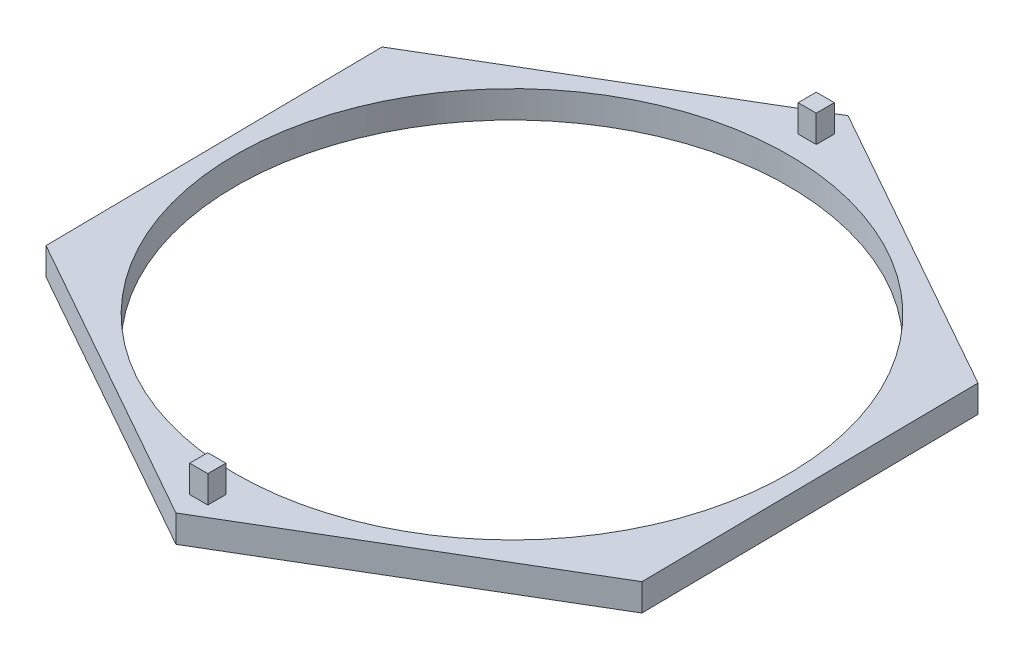
ISO-10303-21;
HEADER;
FILE_DESCRIPTION(('STEP AP214'),'2;1');
FILE_NAME('part.step','',(''),(''),'','','');
FILE_SCHEMA(('AUTOMOTIVE_DESIGN { 1 0 10303 214 1 1 1 1 }'));
ENDSEC;
DATA;
#1=APPLICATION_CONTEXT('core data for automotive mechanical design processes');
#2=APPLICATION_PROTOCOL_DEFINITION('international standard','automotive_design',2000,#1);
#3=PRODUCT_CONTEXT('',#1,'mechanical');
#4=PRODUCT('Part','Part','',(#3));
#5=PRODUCT_RELATED_PRODUCT_CATEGORY('part','',(#4));
#6=PRODUCT_DEFINITION_FORMATION('','',#4);
#7=PRODUCT_DEFINITION_CONTEXT('part definition',#1,'design');
#8=PRODUCT_DEFINITION('design','',#6,#7);
#9=PRODUCT_DEFINITION_SHAPE('','',#8);
#10=(LENGTH_UNIT() NAMED_UNIT(*) SI_UNIT(.MILLI.,.METRE.));
#11=(NAMED_UNIT(*) PLANE_ANGLE_UNIT() SI_UNIT($,.RADIAN.));
#12=(NAMED_UNIT(*) SI_UNIT($,.STERADIAN.) SOLID_ANGLE_UNIT());
#13=UNCERTAINTY_MEASURE_WITH_UNIT(LENGTH_MEASURE(1.E-05),#10,'distance_accuracy_value','');
#14=(GEOMETRIC_REPRESENTATION_CONTEXT(3) GLOBAL_UNCERTAINTY_ASSIGNED_CONTEXT((#13)) GLOBAL_UNIT_ASSIGNED_CONTEXT((#10,
#11,#12)) REPRESENTATION_CONTEXT('',''));
#15=CARTESIAN_POINT('',(0.,0.,0.));
#16=DIRECTION('',(0.,0.,1.));
#17=DIRECTION('',(1.,0.,0.));
#18=AXIS2_PLACEMENT_3D('',#15,#16,#17);
#19=CARTESIAN_POINT('',(0.,3.,0.));
#20=DIRECTION('',(0.,1.,0.));
#21=DIRECTION('',(0.,0.,1.));
#22=AXIS2_PLACEMENT_3D('',#19,#20,#21);
#23=PLANE('',#22);
#24=CARTESIAN_POINT('',(0.,3.,0.));
#25=DIRECTION('',(0.,1.,0.));
#26=DIRECTION('',(0.,0.,1.));
#27=AXIS2_PLACEMENT_3D('',#24,#25,#26);
#28=CIRCLE('',#27,30.5);
#29=CARTESIAN_POINT('',(0.,3.,30.5));
#30=VERTEX_POINT('',#29);
#31=EDGE_CURVE('E214',#30,#30,#28,.T.);
#32=ORIENTED_EDGE('',*,*,#31,.F.);
#33=EDGE_LOOP('',(#32));
#34=FACE_BOUND('',#33,.T.);
#35=DIRECTION('',(-0.860085950933249,0.,0.510149151726482));
#36=VECTOR('',#35,1.);
#37=CARTESIAN_POINT('',(-0.441294633941033,3.,-37.5251727828053));
#38=LINE('',#37,#36);
#39=CARTESIAN_POINT('',(-0.441294633941033,3.,-37.5251727828053));
#40=VERTEX_POINT('',#39);
#41=CARTESIAN_POINT('',(-32.7184002282803,3.,-18.3804140278559));
#42=VERTEX_POINT('',#41);
#43=EDGE_CURVE('E223',#40,#42,#38,.T.);
#44=ORIENTED_EDGE('',*,*,#43,.T.);
#45=DIRECTION('',(0.0117591496475904,0.,0.999930858809531));
#46=VECTOR('',#45,1.);
#47=CARTESIAN_POINT('',(-32.7184002282803,3.,-18.3804140278559));
#48=LINE('',#47,#46);
#49=CARTESIAN_POINT('',(-32.2771055943392,3.,19.1447587549493));
#50=VERTEX_POINT('',#49);
#51=EDGE_CURVE('E227',#42,#50,#48,.T.);
#52=ORIENTED_EDGE('',*,*,#51,.T.);
#53=DIRECTION('',(0.87184510058084,0.,0.489781707083049));
#54=VECTOR('',#53,1.);
#55=CARTESIAN_POINT('',(-32.2771055943392,3.,19.1447587549493));
#56=LINE('',#55,#54);
#57=CARTESIAN_POINT('',(0.441294633941026,3.,37.5251727828053));
#58=VERTEX_POINT('',#57);
#59=EDGE_CURVE('E231',#50,#58,#56,.T.);
#60=ORIENTED_EDGE('',*,*,#59,.T.);
#61=DIRECTION('',(0.860085950933249,0.,-0.510149151726482));
#62=VECTOR('',#61,1.);
#63=CARTESIAN_POINT('',(0.441294633941026,3.,37.5251727828053));
#64=LINE('',#63,#62);
#65=CARTESIAN_POINT('',(32.7184002282803,3.,18.3804140278559));
#66=VERTEX_POINT('',#65);
#67=EDGE_CURVE('E234',#58,#66,#64,.T.);
#68=ORIENTED_EDGE('',*,*,#67,.T.);
#69=DIRECTION('',(-0.0117591496475908,0.,-0.999930858809531));
#70=VECTOR('',#69,1.);
#71=CARTESIAN_POINT('',(32.7184002282803,3.,18.3804140278559));
#72=LINE('',#71,#70);
#73=CARTESIAN_POINT('',(32.2771055943392,3.,-19.1447587549493));
#74=VERTEX_POINT('',#73);
#75=EDGE_CURVE('E237',#66,#74,#72,.T.);
#76=ORIENTED_EDGE('',*,*,#75,.T.);
#77=DIRECTION('',(-0.871845100580839,0.,-0.489781707083049));
#78=VECTOR('',#77,1.);
#79=CARTESIAN_POINT('',(32.2771055943392,3.,-19.1447587549493));
#80=LINE('',#79,#78);
#81=EDGE_CURVE('E240',#74,#40,#80,.T.);
#82=ORIENTED_EDGE('',*,*,#81,.T.);
#83=EDGE_LOOP('',(#44,#52,#60,#68,#76,#82));
#84=FACE_BOUND('',#83,.T.);
#85=DIRECTION('',(1.,0.,0.));
#86=VECTOR('',#85,1.);
#87=CARTESIAN_POINT('',(0.558705366058969,3.,-33.0109900705263));
#88=LINE('',#87,#86);
#89=CARTESIAN_POINT('',(-1.44129463394103,3.,-33.0109900705263));
#90=VERTEX_POINT('',#89);
#91=CARTESIAN_POINT('',(0.558705366058969,3.,-33.0109900705263));
#92=VERTEX_POINT('',#91);
#93=EDGE_CURVE('E175',#90,#92,#88,.T.);
#94=ORIENTED_EDGE('',*,*,#93,.F.);
#95=DIRECTION('',(0.,0.,1.));
#96=VECTOR('',#95,1.);
#97=CARTESIAN_POINT('',(-1.44129463394103,3.,-35.0109900705263));
#98=LINE('',#97,#96);
#99=CARTESIAN_POINT('',(-1.44129463394103,3.,-35.0109900705263));
#100=VERTEX_POINT('',#99);
#101=EDGE_CURVE('E170',#100,#90,#98,.T.);
#102=ORIENTED_EDGE('',*,*,#101,.F.);
#103=DIRECTION('',(-1.,0.,0.));
#104=VECTOR('',#103,1.);
#105=CARTESIAN_POINT('',(0.558705366058968,3.,-35.0109900705263));
#106=LINE('',#105,#104);
#107=CARTESIAN_POINT('',(0.558705366058968,3.,-35.0109900705263));
#108=VERTEX_POINT('',#107);
#109=EDGE_CURVE('E185',#108,#100,#106,.T.);
#110=ORIENTED_EDGE('',*,*,#109,.F.);
#111=DIRECTION('',(0.,0.,-1.));
#112=VECTOR('',#111,1.);
#113=CARTESIAN_POINT('',(0.558705366058968,3.,-35.0109900705263));
#114=LINE('',#113,#112);
#115=EDGE_CURVE('E197',#92,#108,#114,.T.);
#116=ORIENTED_EDGE('',*,*,#115,.F.);
#117=EDGE_LOOP('',(#94,#102,#110,#116));
#118=FACE_BOUND('',#117,.T.);
#119=DIRECTION('',(1.,0.,0.));
#120=VECTOR('',#119,1.);
#121=CARTESIAN_POINT('',(1.44129463394103,3.,35.0109900705263));
#122=LINE('',#121,#120);
#123=CARTESIAN_POINT('',(-0.558705366058973,3.,35.0109900705263));
#124=VERTEX_POINT('',#123);
#125=CARTESIAN_POINT('',(1.44129463394103,3.,35.0109900705263));
#126=VERTEX_POINT('',#125);
#127=EDGE_CURVE('E484',#124,#126,#122,.T.);
#128=ORIENTED_EDGE('',*,*,#127,.F.);
#129=DIRECTION('',(0.,0.,1.));
#130=VECTOR('',#129,1.);
#131=CARTESIAN_POINT('',(-0.558705366058973,3.,35.0109900705263));
#132=LINE('',#131,#130);
#133=CARTESIAN_POINT('',(-0.558705366058973,3.,33.0109900705263));
#134=VERTEX_POINT('',#133);
#135=EDGE_CURVE('E167',#134,#124,#132,.T.);
#136=ORIENTED_EDGE('',*,*,#135,.F.);
#137=DIRECTION('',(-1.,0.,0.));
#138=VECTOR('',#137,1.);
#139=CARTESIAN_POINT('',(1.44129463394103,3.,33.0109900705263));
#140=LINE('',#139,#138);
#141=CARTESIAN_POINT('',(1.44129463394103,3.,33.0109900705263));
#142=VERTEX_POINT('',#141);
#143=EDGE_CURVE('E163',#142,#134,#140,.T.);
#144=ORIENTED_EDGE('',*,*,#143,.F.);
#145=DIRECTION('',(0.,0.,-1.));
#146=VECTOR('',#145,1.);
#147=CARTESIAN_POINT('',(1.44129463394103,3.,35.0109900705263));
#148=LINE('',#147,#146);
#149=EDGE_CURVE('E480',#126,#142,#148,.T.);
#150=ORIENTED_EDGE('',*,*,#149,.F.);
#151=EDGE_LOOP('',(#128,#136,#144,#150));
#152=FACE_BOUND('',#151,.T.);
#153=ADVANCED_FACE('F39',(#34,#84,#118,#152),#23,.T.);
#154=CARTESIAN_POINT('',(-0.441294633941033,3.,-37.5251727828053));
#155=DIRECTION('',(0.510149151726482,0.,0.860085950933249));
#156=DIRECTION('',(0.860085950933249,0.,-0.510149151726482));
#157=AXIS2_PLACEMENT_3D('',#154,#155,#156);
#158=PLANE('',#157);
#159=DIRECTION('',(-0.860085950933249,0.,0.510149151726482));
#160=VECTOR('',#159,1.);
#161=CARTESIAN_POINT('',(-0.441294633941033,0.,-37.5251727828053));
#162=LINE('',#161,#160);
#163=CARTESIAN_POINT('',(-0.441294633941033,0.,-37.5251727828053));
#164=VERTEX_POINT('',#163);
#165=CARTESIAN_POINT('',(-32.7184002282803,0.,-18.3804140278559));
#166=VERTEX_POINT('',#165);
#167=EDGE_CURVE('E219',#164,#166,#162,.T.);
#168=ORIENTED_EDGE('',*,*,#167,.T.);
#169=DIRECTION('',(0.,-1.,0.));
#170=VECTOR('',#169,1.);
#171=CARTESIAN_POINT('',(-32.7184002282803,3.,-18.3804140278559));
#172=LINE('',#171,#170);
#173=EDGE_CURVE('E11',#42,#166,#172,.T.);
#174=ORIENTED_EDGE('',*,*,#173,.F.);
#175=ORIENTED_EDGE('',*,*,#43,.F.);
#176=DIRECTION('',(0.,-1.,0.));
#177=VECTOR('',#176,1.);
#178=CARTESIAN_POINT('',(-0.441294633941033,3.,-37.5251727828053));
#179=LINE('',#178,#177);
#180=EDGE_CURVE('E243',#40,#164,#179,.T.);
#181=ORIENTED_EDGE('',*,*,#180,.T.);
#182=EDGE_LOOP('',(#168,#174,#175,#181));
#183=FACE_BOUND('',#182,.T.);
#184=ADVANCED_FACE('F41',(#183),#158,.F.);
#185=CARTESIAN_POINT('',(-32.7184002282803,3.,-18.3804140278559));
#186=DIRECTION('',(0.999930858809531,0.,-0.0117591496475904));
#187=DIRECTION('',(-0.0117591496475904,0.,-0.999930858809531));
#188=AXIS2_PLACEMENT_3D('',#185,#186,#187);
#189=PLANE('',#188);
#190=DIRECTION('',(0.0117591496475904,0.,0.999930858809531));
#191=VECTOR('',#190,1.);
#192=CARTESIAN_POINT('',(-32.7184002282803,0.,-18.3804140278559));
#193=LINE('',#192,#191);
#194=CARTESIAN_POINT('',(-32.2771055943392,0.,19.1447587549493));
#195=VERTEX_POINT('',#194);
#196=EDGE_CURVE('E247',#166,#195,#193,.T.);
#197=ORIENTED_EDGE('',*,*,#196,.T.);
#198=DIRECTION('',(0.,-1.,0.));
#199=VECTOR('',#198,1.);
#200=CARTESIAN_POINT('',(-32.2771055943392,3.,19.1447587549493));
#201=LINE('',#200,#199);
#202=EDGE_CURVE('E48',#50,#195,#201,.T.);
#203=ORIENTED_EDGE('',*,*,#202,.F.);
#204=ORIENTED_EDGE('',*,*,#51,.F.);
#205=ORIENTED_EDGE('',*,*,#173,.T.);
#206=EDGE_LOOP('',(#197,#203,#204,#205));
#207=FACE_BOUND('',#206,.T.);
#208=ADVANCED_FACE('F304',(#207),#189,.F.);
#209=CARTESIAN_POINT('',(-32.2771055943392,3.,19.1447587549493));
#210=DIRECTION('',(0.489781707083049,0.,-0.871845100580839));
#211=DIRECTION('',(-0.87184510058084,0.,-0.489781707083049));
#212=AXIS2_PLACEMENT_3D('',#209,#210,#211);
#213=PLANE('',#212);
#214=DIRECTION('',(0.87184510058084,0.,0.489781707083049));
#215=VECTOR('',#214,1.);
#216=CARTESIAN_POINT('',(-32.2771055943392,0.,19.1447587549493));
#217=LINE('',#216,#215);
#218=CARTESIAN_POINT('',(0.441294633941026,0.,37.5251727828053));
#219=VERTEX_POINT('',#218);
#220=EDGE_CURVE('E250',#195,#219,#217,.T.);
#221=ORIENTED_EDGE('',*,*,#220,.T.);
#222=DIRECTION('',(0.,-1.,0.));
#223=VECTOR('',#222,1.);
#224=CARTESIAN_POINT('',(0.441294633941026,3.,37.5251727828053));
#225=LINE('',#224,#223);
#226=EDGE_CURVE('E272',#58,#219,#225,.T.);
#227=ORIENTED_EDGE('',*,*,#226,.F.);
#228=ORIENTED_EDGE('',*,*,#59,.F.);
#229=ORIENTED_EDGE('',*,*,#202,.T.);
#230=EDGE_LOOP('',(#221,#227,#228,#229));
#231=FACE_BOUND('',#230,.T.);
#232=ADVANCED_FACE('F281',(#231),#213,.F.);
#233=CARTESIAN_POINT('',(0.441294633941026,3.,37.5251727828053));
#234=DIRECTION('',(-0.510149151726482,0.,-0.860085950933249));
#235=DIRECTION('',(-0.860085950933249,0.,0.510149151726482));
#236=AXIS2_PLACEMENT_3D('',#233,#234,#235);
#237=PLANE('',#236);
#238=DIRECTION('',(0.860085950933249,0.,-0.510149151726482));
#239=VECTOR('',#238,1.);
#240=CARTESIAN_POINT('',(0.441294633941026,0.,37.5251727828053));
#241=LINE('',#240,#239);
#242=CARTESIAN_POINT('',(32.7184002282803,0.,18.3804140278559));
#243=VERTEX_POINT('',#242);
#244=EDGE_CURVE('E253',#219,#243,#241,.T.);
#245=ORIENTED_EDGE('',*,*,#244,.T.);
#246=DIRECTION('',(0.,-1.,0.));
#247=VECTOR('',#246,1.);
#248=CARTESIAN_POINT('',(32.7184002282803,3.,18.3804140278559));
#249=LINE('',#248,#247);
#250=EDGE_CURVE('E268',#66,#243,#249,.T.);
#251=ORIENTED_EDGE('',*,*,#250,.F.);
#252=ORIENTED_EDGE('',*,*,#67,.F.);
#253=ORIENTED_EDGE('',*,*,#226,.T.);
#254=EDGE_LOOP('',(#245,#251,#252,#253));
#255=FACE_BOUND('',#254,.T.);
#256=ADVANCED_FACE('F292',(#255),#237,.F.);
#257=CARTESIAN_POINT('',(32.7184002282803,3.,18.3804140278559));
#258=DIRECTION('',(-0.999930858809531,0.,0.0117591496475908));
#259=DIRECTION('',(0.0117591496475908,0.,0.999930858809531));
#260=AXIS2_PLACEMENT_3D('',#257,#258,#259);
#261=PLANE('',#260);
#262=DIRECTION('',(-0.0117591496475908,0.,-0.999930858809531));
#263=VECTOR('',#262,1.);
#264=CARTESIAN_POINT('',(32.7184002282803,0.,18.3804140278559));
#265=LINE('',#264,#263);
#266=CARTESIAN_POINT('',(32.2771055943392,0.,-19.1447587549493));
#267=VERTEX_POINT('',#266);
#268=EDGE_CURVE('E256',#243,#267,#265,.T.);
#269=ORIENTED_EDGE('',*,*,#268,.T.);
#270=DIRECTION('',(0.,-1.,0.));
#271=VECTOR('',#270,1.);
#272=CARTESIAN_POINT('',(32.2771055943392,3.,-19.1447587549493));
#273=LINE('',#272,#271);
#274=EDGE_CURVE('E264',#74,#267,#273,.T.);
#275=ORIENTED_EDGE('',*,*,#274,.F.);
#276=ORIENTED_EDGE('',*,*,#75,.F.);
#277=ORIENTED_EDGE('',*,*,#250,.T.);
#278=EDGE_LOOP('',(#269,#275,#276,#277));
#279=FACE_BOUND('',#278,.T.);
#280=ADVANCED_FACE('F296',(#279),#261,.F.);
#281=CARTESIAN_POINT('',(32.2771055943392,3.,-19.1447587549493));
#282=DIRECTION('',(-0.489781707083049,0.,0.87184510058084));
#283=DIRECTION('',(0.87184510058084,0.,0.489781707083049));
#284=AXIS2_PLACEMENT_3D('',#281,#282,#283);
#285=PLANE('',#284);
#286=DIRECTION('',(-0.871845100580839,0.,-0.489781707083049));
#287=VECTOR('',#286,1.);
#288=CARTESIAN_POINT('',(32.2771055943392,0.,-19.1447587549493));
#289=LINE('',#288,#287);
#290=EDGE_CURVE('E228',#267,#164,#289,.T.);
#291=ORIENTED_EDGE('',*,*,#290,.T.);
#292=ORIENTED_EDGE('',*,*,#180,.F.);
#293=ORIENTED_EDGE('',*,*,#81,.F.);
#294=ORIENTED_EDGE('',*,*,#274,.T.);
#295=EDGE_LOOP('',(#291,#292,#293,#294));
#296=FACE_BOUND('',#295,.T.);
#297=ADVANCED_FACE('F307',(#296),#285,.F.);
#298=CARTESIAN_POINT('',(0.,0.,0.));
#299=DIRECTION('',(0.,1.,0.));
#300=DIRECTION('',(0.,0.,1.));
#301=AXIS2_PLACEMENT_3D('',#298,#299,#300);
#302=PLANE('',#301);
#303=CARTESIAN_POINT('',(0.,0.,0.));
#304=DIRECTION('',(0.,1.,0.));
#305=DIRECTION('',(0.,0.,1.));
#306=AXIS2_PLACEMENT_3D('',#303,#304,#305);
#307=CIRCLE('',#306,30.5);
#308=CARTESIAN_POINT('',(0.,0.,30.5));
#309=VERTEX_POINT('',#308);
#310=EDGE_CURVE('E215',#309,#309,#307,.T.);
#311=ORIENTED_EDGE('',*,*,#310,.T.);
#312=EDGE_LOOP('',(#311));
#313=FACE_BOUND('',#312,.T.);
#314=ORIENTED_EDGE('',*,*,#167,.F.);
#315=ORIENTED_EDGE('',*,*,#290,.F.);
#316=ORIENTED_EDGE('',*,*,#268,.F.);
#317=ORIENTED_EDGE('',*,*,#244,.F.);
#318=ORIENTED_EDGE('',*,*,#220,.F.);
#319=ORIENTED_EDGE('',*,*,#196,.F.);
#320=EDGE_LOOP('',(#314,#315,#316,#317,#318,#319));
#321=FACE_BOUND('',#320,.T.);
#322=ADVANCED_FACE('F287',(#313,#321),#302,.F.);
#323=CARTESIAN_POINT('',(0.,0.,0.));
#324=DIRECTION('',(0.,1.,0.));
#325=DIRECTION('',(0.,0.,1.));
#326=AXIS2_PLACEMENT_3D('',#323,#324,#325);
#327=CYLINDRICAL_SURFACE('',#326,30.5);
#328=ORIENTED_EDGE('',*,*,#310,.F.);
#329=EDGE_LOOP('',(#328));
#330=FACE_BOUND('',#329,.T.);
#331=ORIENTED_EDGE('',*,*,#31,.T.);
#332=EDGE_LOOP('',(#331));
#333=FACE_BOUND('',#332,.T.);
#334=ADVANCED_FACE('F314',(#330,#333),#327,.F.);
#335=CARTESIAN_POINT('',(-1.44129463394103,6.,-35.0109900705263));
#336=DIRECTION('',(1.,0.,0.));
#337=DIRECTION('',(0.,0.,-1.));
#338=AXIS2_PLACEMENT_3D('',#335,#336,#337);
#339=PLANE('',#338);
#340=ORIENTED_EDGE('',*,*,#101,.T.);
#341=DIRECTION('',(0.,-1.,0.));
#342=VECTOR('',#341,1.);
#343=CARTESIAN_POINT('',(-1.44129463394103,6.,-33.0109900705263));
#344=LINE('',#343,#342);
#345=CARTESIAN_POINT('',(-1.44129463394103,6.,-33.0109900705263));
#346=VERTEX_POINT('',#345);
#347=EDGE_CURVE('E211',#346,#90,#344,.T.);
#348=ORIENTED_EDGE('',*,*,#347,.F.);
#349=DIRECTION('',(0.,0.,1.));
#350=VECTOR('',#349,1.);
#351=CARTESIAN_POINT('',(-1.44129463394103,6.,-35.0109900705263));
#352=LINE('',#351,#350);
#353=CARTESIAN_POINT('',(-1.44129463394103,6.,-35.0109900705263));
#354=VERTEX_POINT('',#353);
#355=EDGE_CURVE('E180',#354,#346,#352,.T.);
#356=ORIENTED_EDGE('',*,*,#355,.F.);
#357=DIRECTION('',(0.,-1.,0.));
#358=VECTOR('',#357,1.);
#359=CARTESIAN_POINT('',(-1.44129463394103,6.,-35.0109900705263));
#360=LINE('',#359,#358);
#361=EDGE_CURVE('E193',#354,#100,#360,.T.);
#362=ORIENTED_EDGE('',*,*,#361,.T.);
#363=EDGE_LOOP('',(#340,#348,#356,#362));
#364=FACE_BOUND('',#363,.T.);
#365=ADVANCED_FACE('F328',(#364),#339,.F.);
#366=CARTESIAN_POINT('',(0.558705366058969,6.,-33.0109900705263));
#367=DIRECTION('',(0.,0.,-1.));
#368=DIRECTION('',(-1.,0.,0.));
#369=AXIS2_PLACEMENT_3D('',#366,#367,#368);
#370=PLANE('',#369);
#371=ORIENTED_EDGE('',*,*,#93,.T.);
#372=DIRECTION('',(0.,-1.,0.));
#373=VECTOR('',#372,1.);
#374=CARTESIAN_POINT('',(0.558705366058969,6.,-33.0109900705263));
#375=LINE('',#374,#373);
#376=CARTESIAN_POINT('',(0.558705366058969,6.,-33.0109900705263));
#377=VERTEX_POINT('',#376);
#378=EDGE_CURVE('E207',#377,#92,#375,.T.);
#379=ORIENTED_EDGE('',*,*,#378,.F.);
#380=DIRECTION('',(1.,0.,0.));
#381=VECTOR('',#380,1.);
#382=CARTESIAN_POINT('',(0.558705366058969,6.,-33.0109900705263));
#383=LINE('',#382,#381);
#384=EDGE_CURVE('E184',#346,#377,#383,.T.);
#385=ORIENTED_EDGE('',*,*,#384,.F.);
#386=ORIENTED_EDGE('',*,*,#347,.T.);
#387=EDGE_LOOP('',(#371,#379,#385,#386));
#388=FACE_BOUND('',#387,.T.);
#389=ADVANCED_FACE('F332',(#388),#370,.F.);
#390=CARTESIAN_POINT('',(0.558705366058968,6.,-35.0109900705263));
#391=DIRECTION('',(-1.,0.,0.));
#392=DIRECTION('',(0.,0.,1.));
#393=AXIS2_PLACEMENT_3D('',#390,#391,#392);
#394=PLANE('',#393);
#395=ORIENTED_EDGE('',*,*,#115,.T.);
#396=DIRECTION('',(0.,-1.,0.));
#397=VECTOR('',#396,1.);
#398=CARTESIAN_POINT('',(0.558705366058968,6.,-35.0109900705263));
#399=LINE('',#398,#397);
#400=CARTESIAN_POINT('',(0.558705366058968,6.,-35.0109900705263));
#401=VERTEX_POINT('',#400);
#402=EDGE_CURVE('E63',#401,#108,#399,.T.);
#403=ORIENTED_EDGE('',*,*,#402,.F.);
#404=DIRECTION('',(0.,0.,-1.));
#405=VECTOR('',#404,1.);
#406=CARTESIAN_POINT('',(0.558705366058968,6.,-35.0109900705263));
#407=LINE('',#406,#405);
#408=EDGE_CURVE('E188',#377,#401,#407,.T.);
#409=ORIENTED_EDGE('',*,*,#408,.F.);
#410=ORIENTED_EDGE('',*,*,#378,.T.);
#411=EDGE_LOOP('',(#395,#403,#409,#410));
#412=FACE_BOUND('',#411,.T.);
#413=ADVANCED_FACE('F336',(#412),#394,.F.);
#414=CARTESIAN_POINT('',(0.558705366058968,6.,-35.0109900705263));
#415=DIRECTION('',(0.,0.,1.));
#416=DIRECTION('',(1.,0.,0.));
#417=AXIS2_PLACEMENT_3D('',#414,#415,#416);
#418=PLANE('',#417);
#419=ORIENTED_EDGE('',*,*,#109,.T.);
#420=ORIENTED_EDGE('',*,*,#361,.F.);
#421=DIRECTION('',(-1.,0.,0.));
#422=VECTOR('',#421,1.);
#423=CARTESIAN_POINT('',(0.558705366058968,6.,-35.0109900705263));
#424=LINE('',#423,#422);
#425=EDGE_CURVE('E191',#401,#354,#424,.T.);
#426=ORIENTED_EDGE('',*,*,#425,.F.);
#427=ORIENTED_EDGE('',*,*,#402,.T.);
#428=EDGE_LOOP('',(#419,#420,#426,#427));
#429=FACE_BOUND('',#428,.T.);
#430=ADVANCED_FACE('F340',(#429),#418,.F.);
#431=CARTESIAN_POINT('',(0.,6.,0.));
#432=DIRECTION('',(0.,-1.,0.));
#433=DIRECTION('',(0.,0.,-1.));
#434=AXIS2_PLACEMENT_3D('',#431,#432,#433);
#435=PLANE('',#434);
#436=ORIENTED_EDGE('',*,*,#355,.T.);
#437=ORIENTED_EDGE('',*,*,#384,.T.);
#438=ORIENTED_EDGE('',*,*,#408,.T.);
#439=ORIENTED_EDGE('',*,*,#425,.T.);
#440=EDGE_LOOP('',(#436,#437,#438,#439));
#441=FACE_BOUND('',#440,.T.);
#442=ADVANCED_FACE('F344',(#441),#435,.F.);
#443=CARTESIAN_POINT('',(-0.558705366058973,6.,35.0109900705263));
#444=DIRECTION('',(1.,0.,0.));
#445=DIRECTION('',(0.,0.,-1.));
#446=AXIS2_PLACEMENT_3D('',#443,#444,#445);
#447=PLANE('',#446);
#448=ORIENTED_EDGE('',*,*,#135,.T.);
#449=DIRECTION('',(0.,-1.,0.));
#450=VECTOR('',#449,1.);
#451=CARTESIAN_POINT('',(-0.558705366058973,6.,35.0109900705263));
#452=LINE('',#451,#450);
#453=CARTESIAN_POINT('',(-0.558705366058973,6.,35.0109900705263));
#454=VERTEX_POINT('',#453);
#455=EDGE_CURVE('E146',#454,#124,#452,.T.);
#456=ORIENTED_EDGE('',*,*,#455,.F.);
#457=DIRECTION('',(0.,0.,1.));
#458=VECTOR('',#457,1.);
#459=CARTESIAN_POINT('',(-0.558705366058973,6.,35.0109900705263));
#460=LINE('',#459,#458);
#461=CARTESIAN_POINT('',(-0.558705366058973,6.,33.0109900705263));
#462=VERTEX_POINT('',#461);
#463=EDGE_CURVE('E154',#462,#454,#460,.T.);
#464=ORIENTED_EDGE('',*,*,#463,.F.);
#465=DIRECTION('',(0.,-1.,0.));
#466=VECTOR('',#465,1.);
#467=CARTESIAN_POINT('',(-0.558705366058973,6.,33.0109900705263));
#468=LINE('',#467,#466);
#469=EDGE_CURVE('E476',#462,#134,#468,.T.);
#470=ORIENTED_EDGE('',*,*,#469,.T.);
#471=EDGE_LOOP('',(#448,#456,#464,#470));
#472=FACE_BOUND('',#471,.T.);
#473=ADVANCED_FACE('F165',(#472),#447,.F.);
#474=CARTESIAN_POINT('',(1.44129463394103,6.,35.0109900705263));
#475=DIRECTION('',(0.,0.,-1.));
#476=DIRECTION('',(-1.,0.,0.));
#477=AXIS2_PLACEMENT_3D('',#474,#475,#476);
#478=PLANE('',#477);
#479=ORIENTED_EDGE('',*,*,#127,.T.);
#480=DIRECTION('',(0.,-1.,0.));
#481=VECTOR('',#480,1.);
#482=CARTESIAN_POINT('',(1.44129463394103,6.,35.0109900705263));
#483=LINE('',#482,#481);
#484=CARTESIAN_POINT('',(1.44129463394103,6.,35.0109900705263));
#485=VERTEX_POINT('',#484);
#486=EDGE_CURVE('E149',#485,#126,#483,.T.);
#487=ORIENTED_EDGE('',*,*,#486,.F.);
#488=DIRECTION('',(1.,0.,0.));
#489=VECTOR('',#488,1.);
#490=CARTESIAN_POINT('',(1.44129463394103,6.,35.0109900705263));
#491=LINE('',#490,#489);
#492=EDGE_CURVE('E142',#454,#485,#491,.T.);
#493=ORIENTED_EDGE('',*,*,#492,.F.);
#494=ORIENTED_EDGE('',*,*,#455,.T.);
#495=EDGE_LOOP('',(#479,#487,#493,#494));
#496=FACE_BOUND('',#495,.T.);
#497=ADVANCED_FACE('F144',(#496),#478,.F.);
#498=CARTESIAN_POINT('',(1.44129463394103,6.,35.0109900705263));
#499=DIRECTION('',(-1.,0.,0.));
#500=DIRECTION('',(0.,0.,1.));
#501=AXIS2_PLACEMENT_3D('',#498,#499,#500);
#502=PLANE('',#501);
#503=ORIENTED_EDGE('',*,*,#149,.T.);
#504=DIRECTION('',(0.,-1.,0.));
#505=VECTOR('',#504,1.);
#506=CARTESIAN_POINT('',(1.44129463394103,6.,33.0109900705263));
#507=LINE('',#506,#505);
#508=CARTESIAN_POINT('',(1.44129463394103,6.,33.0109900705263));
#509=VERTEX_POINT('',#508);
#510=EDGE_CURVE('E55',#509,#142,#507,.T.);
#511=ORIENTED_EDGE('',*,*,#510,.F.);
#512=DIRECTION('',(0.,0.,-1.));
#513=VECTOR('',#512,1.);
#514=CARTESIAN_POINT('',(1.44129463394103,6.,35.0109900705263));
#515=LINE('',#514,#513);
#516=EDGE_CURVE('E153',#485,#509,#515,.T.);
#517=ORIENTED_EDGE('',*,*,#516,.F.);
#518=ORIENTED_EDGE('',*,*,#486,.T.);
#519=EDGE_LOOP('',(#503,#511,#517,#518));
#520=FACE_BOUND('',#519,.T.);
#521=ADVANCED_FACE('F352',(#520),#502,.F.);
#522=CARTESIAN_POINT('',(1.44129463394103,6.,33.0109900705263));
#523=DIRECTION('',(0.,0.,1.));
#524=DIRECTION('',(1.,0.,0.));
#525=AXIS2_PLACEMENT_3D('',#522,#523,#524);
#526=PLANE('',#525);
#527=ORIENTED_EDGE('',*,*,#143,.T.);
#528=ORIENTED_EDGE('',*,*,#469,.F.);
#529=DIRECTION('',(-1.,0.,0.));
#530=VECTOR('',#529,1.);
#531=CARTESIAN_POINT('',(1.44129463394103,6.,33.0109900705263));
#532=LINE('',#531,#530);
#533=EDGE_CURVE('E158',#509,#462,#532,.T.);
#534=ORIENTED_EDGE('',*,*,#533,.F.);
#535=ORIENTED_EDGE('',*,*,#510,.T.);
#536=EDGE_LOOP('',(#527,#528,#534,#535));
#537=FACE_BOUND('',#536,.T.);
#538=ADVANCED_FACE('F355',(#537),#526,.F.);
#539=CARTESIAN_POINT('',(0.,6.,0.));
#540=DIRECTION('',(0.,1.,0.));
#541=DIRECTION('',(0.,0.,1.));
#542=AXIS2_PLACEMENT_3D('',#539,#540,#541);
#543=PLANE('',#542);
#544=ORIENTED_EDGE('',*,*,#463,.T.);
#545=ORIENTED_EDGE('',*,*,#492,.T.);
#546=ORIENTED_EDGE('',*,*,#516,.T.);
#547=ORIENTED_EDGE('',*,*,#533,.T.);
#548=EDGE_LOOP('',(#544,#545,#546,#547));
#549=FACE_BOUND('',#548,.T.);
#550=ADVANCED_FACE('F157',(#549),#543,.T.);
#551=CLOSED_SHELL('',(#153,#184,#208,#232,#256,#280,#297,#322,#334,#365,#389,#413,#430,#442,
#473,#497,#521,#538,#550));
#552=MANIFOLD_SOLID_BREP('B2',#551);
#553=ADVANCED_BREP_SHAPE_REPRESENTATION('',(#18,#552),#14);
#554=SHAPE_DEFINITION_REPRESENTATION(#9,#553);
ENDSEC;
END-ISO-10303-21;
